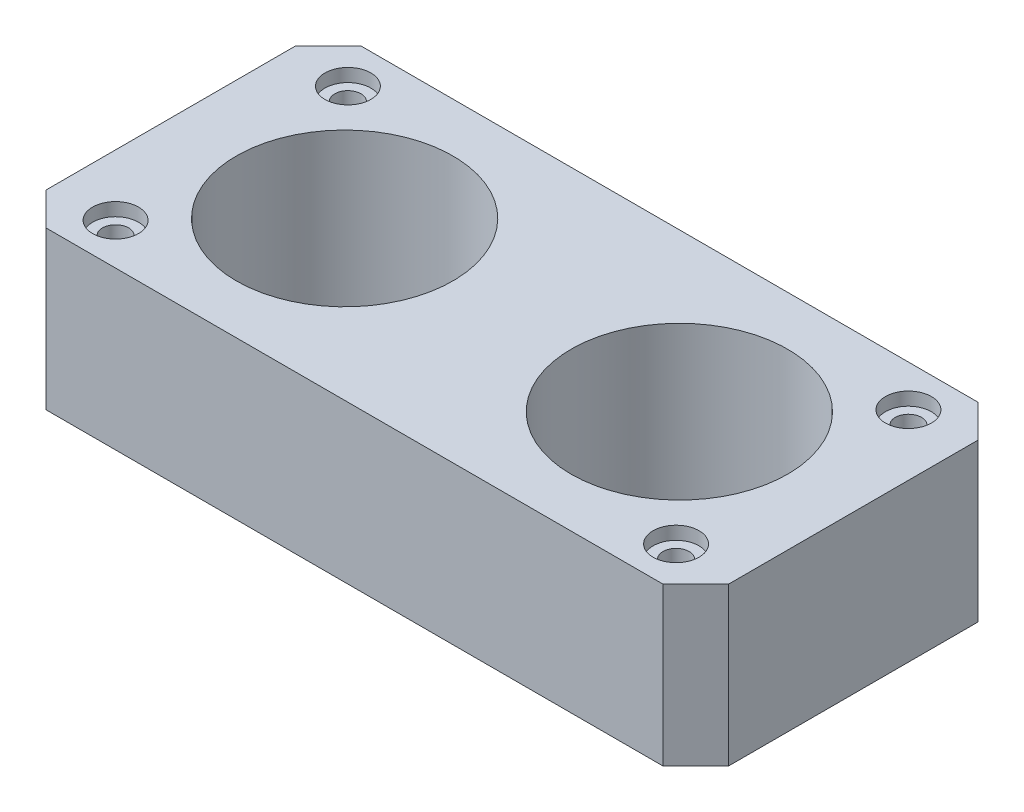
ISO-10303-21;
HEADER;
FILE_DESCRIPTION(('STEP AP214'),'2;1');
FILE_NAME('part.step','',(''),(''),'','','');
FILE_SCHEMA(('AUTOMOTIVE_DESIGN { 1 0 10303 214 1 1 1 1 }'));
ENDSEC;
DATA;
#1=APPLICATION_CONTEXT('core data for automotive mechanical design processes');
#2=APPLICATION_PROTOCOL_DEFINITION('international standard','automotive_design',2000,#1);
#3=PRODUCT_CONTEXT('',#1,'mechanical');
#4=PRODUCT('Part','Part','',(#3));
#5=PRODUCT_RELATED_PRODUCT_CATEGORY('part','',(#4));
#6=PRODUCT_DEFINITION_FORMATION('','',#4);
#7=PRODUCT_DEFINITION_CONTEXT('part definition',#1,'design');
#8=PRODUCT_DEFINITION('design','',#6,#7);
#9=PRODUCT_DEFINITION_SHAPE('','',#8);
#10=(LENGTH_UNIT() NAMED_UNIT(*) SI_UNIT(.MILLI.,.METRE.));
#11=(NAMED_UNIT(*) PLANE_ANGLE_UNIT() SI_UNIT($,.RADIAN.));
#12=(NAMED_UNIT(*) SI_UNIT($,.STERADIAN.) SOLID_ANGLE_UNIT());
#13=UNCERTAINTY_MEASURE_WITH_UNIT(LENGTH_MEASURE(1.E-05),#10,'distance_accuracy_value','');
#14=(GEOMETRIC_REPRESENTATION_CONTEXT(3) GLOBAL_UNCERTAINTY_ASSIGNED_CONTEXT((#13)) GLOBAL_UNIT_ASSIGNED_CONTEXT((#10,
#11,#12)) REPRESENTATION_CONTEXT('',''));
#15=CARTESIAN_POINT('',(0.,0.,0.));
#16=DIRECTION('',(0.,0.,1.));
#17=DIRECTION('',(1.,0.,0.));
#18=AXIS2_PLACEMENT_3D('',#15,#16,#17);
#19=CARTESIAN_POINT('',(0.,0.,0.));
#20=DIRECTION('',(0.,1.,0.));
#21=DIRECTION('',(0.,0.,1.));
#22=AXIS2_PLACEMENT_3D('',#19,#20,#21);
#23=PLANE('',#22);
#24=CARTESIAN_POINT('',(-12.75,0.,0.));
#25=DIRECTION('',(0.,1.,0.));
#26=DIRECTION('',(0.,0.,1.));
#27=AXIS2_PLACEMENT_3D('',#24,#25,#26);
#28=CIRCLE('',#27,8.25);
#29=CARTESIAN_POINT('',(-12.75,0.,8.25));
#30=VERTEX_POINT('',#29);
#31=EDGE_CURVE('E235',#30,#30,#28,.T.);
#32=ORIENTED_EDGE('',*,*,#31,.T.);
#33=EDGE_LOOP('',(#32));
#34=FACE_BOUND('',#33,.T.);
#35=CARTESIAN_POINT('',(12.75,0.,0.));
#36=DIRECTION('',(0.,1.,0.));
#37=DIRECTION('',(0.,0.,1.));
#38=AXIS2_PLACEMENT_3D('',#35,#36,#37);
#39=CIRCLE('',#38,8.25);
#40=CARTESIAN_POINT('',(12.75,0.,8.24999999999999));
#41=VERTEX_POINT('',#40);
#42=EDGE_CURVE('E239',#41,#41,#39,.T.);
#43=ORIENTED_EDGE('',*,*,#42,.T.);
#44=EDGE_LOOP('',(#43));
#45=FACE_BOUND('',#44,.T.);
#46=CARTESIAN_POINT('',(-21.35,0.,-8.85));
#47=DIRECTION('',(0.,1.,0.));
#48=DIRECTION('',(0.,0.,1.));
#49=AXIS2_PLACEMENT_3D('',#46,#47,#48);
#50=CIRCLE('',#49,0.999999999999998);
#51=CARTESIAN_POINT('',(-21.35,0.,-7.85));
#52=VERTEX_POINT('',#51);
#53=EDGE_CURVE('E225',#52,#52,#50,.T.);
#54=ORIENTED_EDGE('',*,*,#53,.T.);
#55=EDGE_LOOP('',(#54));
#56=FACE_BOUND('',#55,.T.);
#57=CARTESIAN_POINT('',(21.35,0.,-8.85));
#58=DIRECTION('',(0.,1.,0.));
#59=DIRECTION('',(0.,0.,1.));
#60=AXIS2_PLACEMENT_3D('',#57,#58,#59);
#61=CIRCLE('',#60,1.);
#62=CARTESIAN_POINT('',(21.35,0.,-7.85));
#63=VERTEX_POINT('',#62);
#64=EDGE_CURVE('E222',#63,#63,#61,.T.);
#65=ORIENTED_EDGE('',*,*,#64,.T.);
#66=EDGE_LOOP('',(#65));
#67=FACE_BOUND('',#66,.T.);
#68=CARTESIAN_POINT('',(21.35,0.,8.85));
#69=DIRECTION('',(0.,1.,0.));
#70=DIRECTION('',(0.,0.,1.));
#71=AXIS2_PLACEMENT_3D('',#68,#69,#70);
#72=CIRCLE('',#71,1.);
#73=CARTESIAN_POINT('',(21.35,0.,9.85));
#74=VERTEX_POINT('',#73);
#75=EDGE_CURVE('E226',#74,#74,#72,.T.);
#76=ORIENTED_EDGE('',*,*,#75,.T.);
#77=EDGE_LOOP('',(#76));
#78=FACE_BOUND('',#77,.T.);
#79=CARTESIAN_POINT('',(-21.35,0.,8.85));
#80=DIRECTION('',(0.,1.,0.));
#81=DIRECTION('',(0.,0.,1.));
#82=AXIS2_PLACEMENT_3D('',#79,#80,#81);
#83=CIRCLE('',#82,1.);
#84=CARTESIAN_POINT('',(-21.35,0.,9.85));
#85=VERTEX_POINT('',#84);
#86=EDGE_CURVE('E229',#85,#85,#83,.T.);
#87=ORIENTED_EDGE('',*,*,#86,.T.);
#88=EDGE_LOOP('',(#87));
#89=FACE_BOUND('',#88,.T.);
#90=DIRECTION('',(0.,0.,-1.));
#91=VECTOR('',#90,1.);
#92=CARTESIAN_POINT('',(26.,0.,-12.));
#93=LINE('',#92,#91);
#94=CARTESIAN_POINT('',(26.,0.,9.49999999999999));
#95=VERTEX_POINT('',#94);
#96=CARTESIAN_POINT('',(26.,0.,-9.49999999999999));
#97=VERTEX_POINT('',#96);
#98=EDGE_CURVE('E245',#95,#97,#93,.T.);
#99=ORIENTED_EDGE('',*,*,#98,.F.);
#100=DIRECTION('',(0.707106781186547,0.,-0.707106781186548));
#101=VECTOR('',#100,1.);
#102=CARTESIAN_POINT('',(26.,0.,9.49999999999999));
#103=LINE('',#102,#101);
#104=CARTESIAN_POINT('',(23.5,0.,12.));
#105=VERTEX_POINT('',#104);
#106=EDGE_CURVE('E325',#95,#105,#103,.F.);
#107=ORIENTED_EDGE('',*,*,#106,.T.);
#108=DIRECTION('',(1.,0.,0.));
#109=VECTOR('',#108,1.);
#110=CARTESIAN_POINT('',(-26.,0.,12.));
#111=LINE('',#110,#109);
#112=CARTESIAN_POINT('',(-23.5,0.,12.));
#113=VERTEX_POINT('',#112);
#114=EDGE_CURVE('E252',#113,#105,#111,.T.);
#115=ORIENTED_EDGE('',*,*,#114,.F.);
#116=DIRECTION('',(0.707106781186548,0.,0.707106781186548));
#117=VECTOR('',#116,1.);
#118=CARTESIAN_POINT('',(-23.5,0.,12.));
#119=LINE('',#118,#117);
#120=CARTESIAN_POINT('',(-26.,0.,9.5));
#121=VERTEX_POINT('',#120);
#122=EDGE_CURVE('E319',#113,#121,#119,.F.);
#123=ORIENTED_EDGE('',*,*,#122,.T.);
#124=DIRECTION('',(0.,0.,1.));
#125=VECTOR('',#124,1.);
#126=CARTESIAN_POINT('',(-26.,0.,-12.));
#127=LINE('',#126,#125);
#128=CARTESIAN_POINT('',(-26.,0.,-9.49999999999999));
#129=VERTEX_POINT('',#128);
#130=EDGE_CURVE('E167',#129,#121,#127,.T.);
#131=ORIENTED_EDGE('',*,*,#130,.F.);
#132=DIRECTION('',(-0.707106781186547,0.,0.707106781186549));
#133=VECTOR('',#132,1.);
#134=CARTESIAN_POINT('',(-26.,0.,-9.49999999999999));
#135=LINE('',#134,#133);
#136=CARTESIAN_POINT('',(-23.5,0.,-12.));
#137=VERTEX_POINT('',#136);
#138=EDGE_CURVE('E321',#129,#137,#135,.F.);
#139=ORIENTED_EDGE('',*,*,#138,.T.);
#140=DIRECTION('',(-1.,0.,0.));
#141=VECTOR('',#140,1.);
#142=CARTESIAN_POINT('',(-26.,0.,-12.));
#143=LINE('',#142,#141);
#144=CARTESIAN_POINT('',(-6.,0.,-12.));
#145=VERTEX_POINT('',#144);
#146=EDGE_CURVE('E168',#145,#137,#143,.T.);
#147=ORIENTED_EDGE('',*,*,#146,.F.);
#148=DIRECTION('',(0.,0.,1.));
#149=VECTOR('',#148,1.);
#150=CARTESIAN_POINT('',(-6.,0.,0.));
#151=LINE('',#150,#149);
#152=CARTESIAN_POINT('',(-6.,0.,-5.5));
#153=VERTEX_POINT('',#152);
#154=EDGE_CURVE('E187',#145,#153,#151,.T.);
#155=ORIENTED_EDGE('',*,*,#154,.T.);
#156=CARTESIAN_POINT('',(-5.5,0.,-5.5));
#157=DIRECTION('',(0.,1.,0.));
#158=DIRECTION('',(0.,0.,1.));
#159=AXIS2_PLACEMENT_3D('',#156,#157,#158);
#160=CIRCLE('',#159,0.5);
#161=CARTESIAN_POINT('',(-5.5,0.,-5.));
#162=VERTEX_POINT('',#161);
#163=EDGE_CURVE('E299',#153,#162,#160,.T.);
#164=ORIENTED_EDGE('',*,*,#163,.T.);
#165=DIRECTION('',(1.,0.,0.));
#166=VECTOR('',#165,1.);
#167=CARTESIAN_POINT('',(0.,0.,-5.));
#168=LINE('',#167,#166);
#169=CARTESIAN_POINT('',(5.5,0.,-5.));
#170=VERTEX_POINT('',#169);
#171=EDGE_CURVE('E184',#162,#170,#168,.T.);
#172=ORIENTED_EDGE('',*,*,#171,.T.);
#173=CARTESIAN_POINT('',(5.5,0.,-5.5));
#174=DIRECTION('',(0.,1.,0.));
#175=DIRECTION('',(0.,0.,1.));
#176=AXIS2_PLACEMENT_3D('',#173,#174,#175);
#177=CIRCLE('',#176,0.5);
#178=CARTESIAN_POINT('',(6.,0.,-5.5));
#179=VERTEX_POINT('',#178);
#180=EDGE_CURVE('E183',#170,#179,#177,.T.);
#181=ORIENTED_EDGE('',*,*,#180,.T.);
#182=DIRECTION('',(0.,0.,1.));
#183=VECTOR('',#182,1.);
#184=CARTESIAN_POINT('',(6.,0.,0.));
#185=LINE('',#184,#183);
#186=CARTESIAN_POINT('',(6.,0.,-12.));
#187=VERTEX_POINT('',#186);
#188=EDGE_CURVE('E173',#187,#179,#185,.T.);
#189=ORIENTED_EDGE('',*,*,#188,.F.);
#190=CARTESIAN_POINT('',(23.5,0.,-12.));
#191=VERTEX_POINT('',#190);
#192=EDGE_CURVE('E157',#191,#187,#143,.T.);
#193=ORIENTED_EDGE('',*,*,#192,.F.);
#194=DIRECTION('',(-0.707106781186546,0.,-0.707106781186549));
#195=VECTOR('',#194,1.);
#196=CARTESIAN_POINT('',(23.5,0.,-12.));
#197=LINE('',#196,#195);
#198=EDGE_CURVE('E323',#191,#97,#197,.F.);
#199=ORIENTED_EDGE('',*,*,#198,.T.);
#200=EDGE_LOOP('',(#99,#107,#115,#123,#131,#139,#147,#155,#164,#172,#181,#189,#193,#199));
#201=FACE_BOUND('',#200,.T.);
#202=ADVANCED_FACE('F41',(#34,#45,#56,#67,#78,#89,#201),#23,.F.);
#203=CARTESIAN_POINT('',(-26.,12.,-12.));
#204=DIRECTION('',(0.,0.,1.));
#205=DIRECTION('',(1.,0.,0.));
#206=AXIS2_PLACEMENT_3D('',#203,#204,#205);
#207=PLANE('',#206);
#208=DIRECTION('',(-1.,0.,0.));
#209=VECTOR('',#208,1.);
#210=CARTESIAN_POINT('',(-26.,12.,-12.));
#211=LINE('',#210,#209);
#212=CARTESIAN_POINT('',(23.5,12.,-12.));
#213=VERTEX_POINT('',#212);
#214=CARTESIAN_POINT('',(-23.5,12.,-12.));
#215=VERTEX_POINT('',#214);
#216=EDGE_CURVE('E251',#213,#215,#211,.T.);
#217=ORIENTED_EDGE('',*,*,#216,.F.);
#218=DIRECTION('',(0.,-1.,0.));
#219=VECTOR('',#218,1.);
#220=CARTESIAN_POINT('',(23.5,12.,-12.));
#221=LINE('',#220,#219);
#222=EDGE_CURVE('E164',#213,#191,#221,.T.);
#223=ORIENTED_EDGE('',*,*,#222,.T.);
#224=ORIENTED_EDGE('',*,*,#192,.T.);
#225=DIRECTION('',(0.,-1.,0.));
#226=VECTOR('',#225,1.);
#227=CARTESIAN_POINT('',(6.,5.,-12.));
#228=LINE('',#227,#226);
#229=CARTESIAN_POINT('',(6.,4.5,-12.));
#230=VERTEX_POINT('',#229);
#231=EDGE_CURVE('E161',#230,#187,#228,.T.);
#232=ORIENTED_EDGE('',*,*,#231,.F.);
#233=CARTESIAN_POINT('',(5.5,4.5,-12.));
#234=DIRECTION('',(0.,0.,1.));
#235=DIRECTION('',(1.,0.,0.));
#236=AXIS2_PLACEMENT_3D('',#233,#234,#235);
#237=CIRCLE('',#236,0.5);
#238=CARTESIAN_POINT('',(5.5,5.,-12.));
#239=VERTEX_POINT('',#238);
#240=EDGE_CURVE('E294',#230,#239,#237,.T.);
#241=ORIENTED_EDGE('',*,*,#240,.T.);
#242=DIRECTION('',(1.,0.,0.));
#243=VECTOR('',#242,1.);
#244=CARTESIAN_POINT('',(0.,5.,-12.));
#245=LINE('',#244,#243);
#246=CARTESIAN_POINT('',(-5.5,5.,-12.));
#247=VERTEX_POINT('',#246);
#248=EDGE_CURVE('E178',#247,#239,#245,.T.);
#249=ORIENTED_EDGE('',*,*,#248,.F.);
#250=CARTESIAN_POINT('',(-5.5,4.5,-12.));
#251=DIRECTION('',(0.,0.,1.));
#252=DIRECTION('',(1.,0.,0.));
#253=AXIS2_PLACEMENT_3D('',#250,#251,#252);
#254=CIRCLE('',#253,0.5);
#255=CARTESIAN_POINT('',(-6.,4.5,-12.));
#256=VERTEX_POINT('',#255);
#257=EDGE_CURVE('E296',#247,#256,#254,.T.);
#258=ORIENTED_EDGE('',*,*,#257,.T.);
#259=DIRECTION('',(0.,-1.,0.));
#260=VECTOR('',#259,1.);
#261=CARTESIAN_POINT('',(-6.,5.,-12.));
#262=LINE('',#261,#260);
#263=EDGE_CURVE('E177',#256,#145,#262,.T.);
#264=ORIENTED_EDGE('',*,*,#263,.T.);
#265=ORIENTED_EDGE('',*,*,#146,.T.);
#266=DIRECTION('',(0.,1.,0.));
#267=VECTOR('',#266,1.);
#268=CARTESIAN_POINT('',(-23.5,12.,-12.));
#269=LINE('',#268,#267);
#270=EDGE_CURVE('E339',#137,#215,#269,.T.);
#271=ORIENTED_EDGE('',*,*,#270,.T.);
#272=EDGE_LOOP('',(#217,#223,#224,#232,#241,#249,#258,#264,#265,#271));
#273=FACE_BOUND('',#272,.T.);
#274=ADVANCED_FACE('F160',(#273),#207,.F.);
#275=CARTESIAN_POINT('',(-21.35,0.,-8.85));
#276=DIRECTION('',(0.,1.,0.));
#277=DIRECTION('',(0.,0.,1.));
#278=AXIS2_PLACEMENT_3D('',#275,#276,#277);
#279=CYLINDRICAL_SURFACE('',#278,0.999999999999998);
#280=ORIENTED_EDGE('',*,*,#53,.F.);
#281=EDGE_LOOP('',(#280));
#282=FACE_BOUND('',#281,.T.);
#283=CARTESIAN_POINT('',(-21.35,11.,-8.85));
#284=DIRECTION('',(0.,1.,0.));
#285=DIRECTION('',(0.,0.,1.));
#286=AXIS2_PLACEMENT_3D('',#283,#284,#285);
#287=CIRCLE('',#286,0.999999999999998);
#288=CARTESIAN_POINT('',(-21.35,11.,-7.85));
#289=VERTEX_POINT('',#288);
#290=EDGE_CURVE('E232',#289,#289,#287,.F.);
#291=ORIENTED_EDGE('',*,*,#290,.F.);
#292=EDGE_LOOP('',(#291));
#293=FACE_BOUND('',#292,.T.);
#294=ADVANCED_FACE('F386',(#282,#293),#279,.F.);
#295=CARTESIAN_POINT('',(21.35,0.,-8.85));
#296=DIRECTION('',(0.,1.,0.));
#297=DIRECTION('',(0.,0.,1.));
#298=AXIS2_PLACEMENT_3D('',#295,#296,#297);
#299=CYLINDRICAL_SURFACE('',#298,1.);
#300=ORIENTED_EDGE('',*,*,#64,.F.);
#301=EDGE_LOOP('',(#300));
#302=FACE_BOUND('',#301,.T.);
#303=CARTESIAN_POINT('',(21.35,11.,-8.85));
#304=DIRECTION('',(0.,1.,0.));
#305=DIRECTION('',(0.,0.,1.));
#306=AXIS2_PLACEMENT_3D('',#303,#304,#305);
#307=CIRCLE('',#306,1.);
#308=CARTESIAN_POINT('',(21.35,11.,-7.85));
#309=VERTEX_POINT('',#308);
#310=EDGE_CURVE('E270',#309,#309,#307,.F.);
#311=ORIENTED_EDGE('',*,*,#310,.F.);
#312=EDGE_LOOP('',(#311));
#313=FACE_BOUND('',#312,.T.);
#314=ADVANCED_FACE('F507',(#302,#313),#299,.F.);
#315=CARTESIAN_POINT('',(21.35,0.,8.85));
#316=DIRECTION('',(0.,1.,0.));
#317=DIRECTION('',(0.,0.,1.));
#318=AXIS2_PLACEMENT_3D('',#315,#316,#317);
#319=CYLINDRICAL_SURFACE('',#318,1.);
#320=ORIENTED_EDGE('',*,*,#75,.F.);
#321=EDGE_LOOP('',(#320));
#322=FACE_BOUND('',#321,.T.);
#323=CARTESIAN_POINT('',(21.35,11.,8.85));
#324=DIRECTION('',(0.,1.,0.));
#325=DIRECTION('',(0.,0.,1.));
#326=AXIS2_PLACEMENT_3D('',#323,#324,#325);
#327=CIRCLE('',#326,1.);
#328=CARTESIAN_POINT('',(21.35,11.,9.85));
#329=VERTEX_POINT('',#328);
#330=EDGE_CURVE('E267',#329,#329,#327,.F.);
#331=ORIENTED_EDGE('',*,*,#330,.F.);
#332=EDGE_LOOP('',(#331));
#333=FACE_BOUND('',#332,.T.);
#334=ADVANCED_FACE('F510',(#322,#333),#319,.F.);
#335=CARTESIAN_POINT('',(-21.35,0.,8.85));
#336=DIRECTION('',(0.,1.,0.));
#337=DIRECTION('',(0.,0.,1.));
#338=AXIS2_PLACEMENT_3D('',#335,#336,#337);
#339=CYLINDRICAL_SURFACE('',#338,1.);
#340=ORIENTED_EDGE('',*,*,#86,.F.);
#341=EDGE_LOOP('',(#340));
#342=FACE_BOUND('',#341,.T.);
#343=CARTESIAN_POINT('',(-21.35,11.,8.85));
#344=DIRECTION('',(0.,1.,0.));
#345=DIRECTION('',(0.,0.,1.));
#346=AXIS2_PLACEMENT_3D('',#343,#344,#345);
#347=CIRCLE('',#346,1.);
#348=CARTESIAN_POINT('',(-21.35,11.,9.85));
#349=VERTEX_POINT('',#348);
#350=EDGE_CURVE('E219',#349,#349,#347,.F.);
#351=ORIENTED_EDGE('',*,*,#350,.F.);
#352=EDGE_LOOP('',(#351));
#353=FACE_BOUND('',#352,.T.);
#354=ADVANCED_FACE('F514',(#342,#353),#339,.F.);
#355=CARTESIAN_POINT('',(0.,12.,0.));
#356=DIRECTION('',(0.,1.,0.));
#357=DIRECTION('',(0.,0.,1.));
#358=AXIS2_PLACEMENT_3D('',#355,#356,#357);
#359=PLANE('',#358);
#360=CARTESIAN_POINT('',(-21.35,12.,8.85));
#361=DIRECTION('',(0.,1.,0.));
#362=DIRECTION('',(0.,0.,1.));
#363=AXIS2_PLACEMENT_3D('',#360,#361,#362);
#364=CIRCLE('',#363,1.75);
#365=CARTESIAN_POINT('',(-21.35,12.,10.6));
#366=VERTEX_POINT('',#365);
#367=EDGE_CURVE('E196',#366,#366,#364,.T.);
#368=ORIENTED_EDGE('',*,*,#367,.F.);
#369=EDGE_LOOP('',(#368));
#370=FACE_BOUND('',#369,.T.);
#371=CARTESIAN_POINT('',(21.35,12.,8.85));
#372=DIRECTION('',(0.,1.,0.));
#373=DIRECTION('',(0.,0.,1.));
#374=AXIS2_PLACEMENT_3D('',#371,#372,#373);
#375=CIRCLE('',#374,1.75);
#376=CARTESIAN_POINT('',(21.35,12.,10.6));
#377=VERTEX_POINT('',#376);
#378=EDGE_CURVE('E208',#377,#377,#375,.T.);
#379=ORIENTED_EDGE('',*,*,#378,.F.);
#380=EDGE_LOOP('',(#379));
#381=FACE_BOUND('',#380,.T.);
#382=CARTESIAN_POINT('',(21.35,12.,-8.85));
#383=DIRECTION('',(0.,1.,0.));
#384=DIRECTION('',(0.,0.,1.));
#385=AXIS2_PLACEMENT_3D('',#382,#383,#384);
#386=CIRCLE('',#385,1.75);
#387=CARTESIAN_POINT('',(21.35,12.,-7.1));
#388=VERTEX_POINT('',#387);
#389=EDGE_CURVE('E202',#388,#388,#386,.T.);
#390=ORIENTED_EDGE('',*,*,#389,.F.);
#391=EDGE_LOOP('',(#390));
#392=FACE_BOUND('',#391,.T.);
#393=CARTESIAN_POINT('',(-21.35,12.,-8.85));
#394=DIRECTION('',(0.,1.,0.));
#395=DIRECTION('',(0.,0.,1.));
#396=AXIS2_PLACEMENT_3D('',#393,#394,#395);
#397=CIRCLE('',#396,1.75);
#398=CARTESIAN_POINT('',(-21.35,12.,-7.1));
#399=VERTEX_POINT('',#398);
#400=EDGE_CURVE('E201',#399,#399,#397,.T.);
#401=ORIENTED_EDGE('',*,*,#400,.F.);
#402=EDGE_LOOP('',(#401));
#403=FACE_BOUND('',#402,.T.);
#404=CARTESIAN_POINT('',(12.75,12.,0.));
#405=DIRECTION('',(0.,1.,0.));
#406=DIRECTION('',(0.,0.,1.));
#407=AXIS2_PLACEMENT_3D('',#404,#405,#406);
#408=CIRCLE('',#407,8.25);
#409=CARTESIAN_POINT('',(12.75,12.,8.24999999999999));
#410=VERTEX_POINT('',#409);
#411=EDGE_CURVE('E242',#410,#410,#408,.T.);
#412=ORIENTED_EDGE('',*,*,#411,.F.);
#413=EDGE_LOOP('',(#412));
#414=FACE_BOUND('',#413,.T.);
#415=DIRECTION('',(1.,0.,0.));
#416=VECTOR('',#415,1.);
#417=CARTESIAN_POINT('',(-26.,12.,12.));
#418=LINE('',#417,#416);
#419=CARTESIAN_POINT('',(-23.5,12.,12.));
#420=VERTEX_POINT('',#419);
#421=CARTESIAN_POINT('',(23.5,12.,12.));
#422=VERTEX_POINT('',#421);
#423=EDGE_CURVE('E256',#420,#422,#418,.T.);
#424=ORIENTED_EDGE('',*,*,#423,.T.);
#425=DIRECTION('',(-0.707106781186547,0.,0.707106781186548));
#426=VECTOR('',#425,1.);
#427=CARTESIAN_POINT('',(17.75,12.,17.75));
#428=LINE('',#427,#426);
#429=CARTESIAN_POINT('',(26.,12.,9.49999999999999));
#430=VERTEX_POINT('',#429);
#431=EDGE_CURVE('E337',#422,#430,#428,.F.);
#432=ORIENTED_EDGE('',*,*,#431,.T.);
#433=DIRECTION('',(0.,0.,-1.));
#434=VECTOR('',#433,1.);
#435=CARTESIAN_POINT('',(26.,12.,-12.));
#436=LINE('',#435,#434);
#437=CARTESIAN_POINT('',(26.,12.,-9.49999999999999));
#438=VERTEX_POINT('',#437);
#439=EDGE_CURVE('E248',#430,#438,#436,.T.);
#440=ORIENTED_EDGE('',*,*,#439,.T.);
#441=DIRECTION('',(0.707106781186546,0.,0.707106781186549));
#442=VECTOR('',#441,1.);
#443=CARTESIAN_POINT('',(17.75,12.,-17.75));
#444=LINE('',#443,#442);
#445=EDGE_CURVE('E335',#438,#213,#444,.F.);
#446=ORIENTED_EDGE('',*,*,#445,.T.);
#447=ORIENTED_EDGE('',*,*,#216,.T.);
#448=DIRECTION('',(0.707106781186547,0.,-0.707106781186549));
#449=VECTOR('',#448,1.);
#450=CARTESIAN_POINT('',(-17.75,12.,-17.75));
#451=LINE('',#450,#449);
#452=CARTESIAN_POINT('',(-26.,12.,-9.49999999999999));
#453=VERTEX_POINT('',#452);
#454=EDGE_CURVE('E63',#215,#453,#451,.F.);
#455=ORIENTED_EDGE('',*,*,#454,.T.);
#456=DIRECTION('',(0.,0.,1.));
#457=VECTOR('',#456,1.);
#458=CARTESIAN_POINT('',(-26.,12.,-12.));
#459=LINE('',#458,#457);
#460=CARTESIAN_POINT('',(-26.,12.,9.5));
#461=VERTEX_POINT('',#460);
#462=EDGE_CURVE('E254',#453,#461,#459,.T.);
#463=ORIENTED_EDGE('',*,*,#462,.T.);
#464=DIRECTION('',(-0.707106781186548,0.,-0.707106781186548));
#465=VECTOR('',#464,1.);
#466=CARTESIAN_POINT('',(-17.75,12.,17.75));
#467=LINE('',#466,#465);
#468=EDGE_CURVE('E332',#461,#420,#467,.F.);
#469=ORIENTED_EDGE('',*,*,#468,.T.);
#470=EDGE_LOOP('',(#424,#432,#440,#446,#447,#455,#463,#469));
#471=FACE_BOUND('',#470,.T.);
#472=CARTESIAN_POINT('',(-12.75,12.,0.));
#473=DIRECTION('',(0.,1.,0.));
#474=DIRECTION('',(0.,0.,1.));
#475=AXIS2_PLACEMENT_3D('',#472,#473,#474);
#476=CIRCLE('',#475,8.25);
#477=CARTESIAN_POINT('',(-12.75,12.,8.25));
#478=VERTEX_POINT('',#477);
#479=EDGE_CURVE('E236',#478,#478,#476,.T.);
#480=ORIENTED_EDGE('',*,*,#479,.F.);
#481=EDGE_LOOP('',(#480));
#482=FACE_BOUND('',#481,.T.);
#483=ADVANCED_FACE('F345',(#370,#381,#392,#403,#414,#471,#482),#359,.T.);
#484=CARTESIAN_POINT('',(26.,12.,-12.));
#485=DIRECTION('',(-1.,0.,0.));
#486=DIRECTION('',(0.,0.,1.));
#487=AXIS2_PLACEMENT_3D('',#484,#485,#486);
#488=PLANE('',#487);
#489=ORIENTED_EDGE('',*,*,#439,.F.);
#490=DIRECTION('',(0.,-1.,0.));
#491=VECTOR('',#490,1.);
#492=CARTESIAN_POINT('',(26.,12.,9.49999999999999));
#493=LINE('',#492,#491);
#494=EDGE_CURVE('E316',#430,#95,#493,.T.);
#495=ORIENTED_EDGE('',*,*,#494,.T.);
#496=ORIENTED_EDGE('',*,*,#98,.T.);
#497=DIRECTION('',(0.,1.,0.));
#498=VECTOR('',#497,1.);
#499=CARTESIAN_POINT('',(26.,12.,-9.49999999999999));
#500=LINE('',#499,#498);
#501=EDGE_CURVE('E301',#97,#438,#500,.T.);
#502=ORIENTED_EDGE('',*,*,#501,.T.);
#503=EDGE_LOOP('',(#489,#495,#496,#502));
#504=FACE_BOUND('',#503,.T.);
#505=ADVANCED_FACE('F366',(#504),#488,.F.);
#506=CARTESIAN_POINT('',(-26.,12.,-12.));
#507=DIRECTION('',(1.,0.,0.));
#508=DIRECTION('',(0.,0.,-1.));
#509=AXIS2_PLACEMENT_3D('',#506,#507,#508);
#510=PLANE('',#509);
#511=ORIENTED_EDGE('',*,*,#462,.F.);
#512=DIRECTION('',(0.,-1.,0.));
#513=VECTOR('',#512,1.);
#514=CARTESIAN_POINT('',(-26.,12.,-9.49999999999999));
#515=LINE('',#514,#513);
#516=EDGE_CURVE('E11',#453,#129,#515,.T.);
#517=ORIENTED_EDGE('',*,*,#516,.T.);
#518=ORIENTED_EDGE('',*,*,#130,.T.);
#519=DIRECTION('',(0.,1.,0.));
#520=VECTOR('',#519,1.);
#521=CARTESIAN_POINT('',(-26.,12.,9.5));
#522=LINE('',#521,#520);
#523=EDGE_CURVE('E50',#121,#461,#522,.T.);
#524=ORIENTED_EDGE('',*,*,#523,.T.);
#525=EDGE_LOOP('',(#511,#517,#518,#524));
#526=FACE_BOUND('',#525,.T.);
#527=ADVANCED_FACE('F351',(#526),#510,.F.);
#528=CARTESIAN_POINT('',(-26.,12.,12.));
#529=DIRECTION('',(0.,0.,-1.));
#530=DIRECTION('',(-1.,0.,0.));
#531=AXIS2_PLACEMENT_3D('',#528,#529,#530);
#532=PLANE('',#531);
#533=ORIENTED_EDGE('',*,*,#114,.T.);
#534=DIRECTION('',(0.,1.,0.));
#535=VECTOR('',#534,1.);
#536=CARTESIAN_POINT('',(23.5,12.,12.));
#537=LINE('',#536,#535);
#538=EDGE_CURVE('E330',#105,#422,#537,.T.);
#539=ORIENTED_EDGE('',*,*,#538,.T.);
#540=ORIENTED_EDGE('',*,*,#423,.F.);
#541=DIRECTION('',(0.,-1.,0.));
#542=VECTOR('',#541,1.);
#543=CARTESIAN_POINT('',(-23.5,12.,12.));
#544=LINE('',#543,#542);
#545=EDGE_CURVE('E327',#420,#113,#544,.T.);
#546=ORIENTED_EDGE('',*,*,#545,.T.);
#547=EDGE_LOOP('',(#533,#539,#540,#546));
#548=FACE_BOUND('',#547,.T.);
#549=ADVANCED_FACE('F358',(#548),#532,.F.);
#550=CARTESIAN_POINT('',(12.75,12.,0.));
#551=DIRECTION('',(0.,-1.,0.));
#552=DIRECTION('',(0.,0.,-1.));
#553=AXIS2_PLACEMENT_3D('',#550,#551,#552);
#554=CYLINDRICAL_SURFACE('',#553,8.25);
#555=ORIENTED_EDGE('',*,*,#411,.T.);
#556=EDGE_LOOP('',(#555));
#557=FACE_BOUND('',#556,.T.);
#558=ORIENTED_EDGE('',*,*,#42,.F.);
#559=EDGE_LOOP('',(#558));
#560=FACE_BOUND('',#559,.T.);
#561=ADVANCED_FACE('F394',(#557,#560),#554,.F.);
#562=CARTESIAN_POINT('',(-12.75,12.,0.));
#563=DIRECTION('',(0.,-1.,0.));
#564=DIRECTION('',(0.,0.,-1.));
#565=AXIS2_PLACEMENT_3D('',#562,#563,#564);
#566=CYLINDRICAL_SURFACE('',#565,8.25);
#567=ORIENTED_EDGE('',*,*,#479,.T.);
#568=EDGE_LOOP('',(#567));
#569=FACE_BOUND('',#568,.T.);
#570=ORIENTED_EDGE('',*,*,#31,.F.);
#571=EDGE_LOOP('',(#570));
#572=FACE_BOUND('',#571,.T.);
#573=ADVANCED_FACE('F496',(#569,#572),#566,.F.);
#574=CARTESIAN_POINT('',(-21.35,11.,8.85));
#575=DIRECTION('',(0.,1.,0.));
#576=DIRECTION('',(0.,0.,1.));
#577=AXIS2_PLACEMENT_3D('',#574,#575,#576);
#578=PLANE('',#577);
#579=CARTESIAN_POINT('',(-21.35,11.,8.85));
#580=DIRECTION('',(0.,1.,0.));
#581=DIRECTION('',(0.,0.,1.));
#582=AXIS2_PLACEMENT_3D('',#579,#580,#581);
#583=CIRCLE('',#582,1.75);
#584=CARTESIAN_POINT('',(-21.35,11.,10.6));
#585=VERTEX_POINT('',#584);
#586=EDGE_CURVE('E211',#585,#585,#583,.T.);
#587=ORIENTED_EDGE('',*,*,#586,.T.);
#588=EDGE_LOOP('',(#587));
#589=FACE_BOUND('',#588,.T.);
#590=ORIENTED_EDGE('',*,*,#350,.T.);
#591=EDGE_LOOP('',(#590));
#592=FACE_BOUND('',#591,.T.);
#593=ADVANCED_FACE('F493',(#589,#592),#578,.T.);
#594=CARTESIAN_POINT('',(-21.35,11.,8.85));
#595=DIRECTION('',(0.,1.,0.));
#596=DIRECTION('',(0.,0.,1.));
#597=AXIS2_PLACEMENT_3D('',#594,#595,#596);
#598=CYLINDRICAL_SURFACE('',#597,1.75);
#599=ORIENTED_EDGE('',*,*,#586,.F.);
#600=EDGE_LOOP('',(#599));
#601=FACE_BOUND('',#600,.T.);
#602=ORIENTED_EDGE('',*,*,#367,.T.);
#603=EDGE_LOOP('',(#602));
#604=FACE_BOUND('',#603,.T.);
#605=ADVANCED_FACE('F488',(#601,#604),#598,.F.);
#606=CARTESIAN_POINT('',(21.35,11.,8.85));
#607=DIRECTION('',(0.,1.,0.));
#608=DIRECTION('',(0.,0.,1.));
#609=AXIS2_PLACEMENT_3D('',#606,#607,#608);
#610=PLANE('',#609);
#611=CARTESIAN_POINT('',(21.35,11.,8.85));
#612=DIRECTION('',(0.,1.,0.));
#613=DIRECTION('',(0.,0.,1.));
#614=AXIS2_PLACEMENT_3D('',#611,#612,#613);
#615=CIRCLE('',#614,1.75);
#616=CARTESIAN_POINT('',(21.35,11.,10.6));
#617=VERTEX_POINT('',#616);
#618=EDGE_CURVE('E205',#617,#617,#615,.T.);
#619=ORIENTED_EDGE('',*,*,#618,.T.);
#620=EDGE_LOOP('',(#619));
#621=FACE_BOUND('',#620,.T.);
#622=ORIENTED_EDGE('',*,*,#330,.T.);
#623=EDGE_LOOP('',(#622));
#624=FACE_BOUND('',#623,.T.);
#625=ADVANCED_FACE('F485',(#621,#624),#610,.T.);
#626=CARTESIAN_POINT('',(21.35,11.,8.85));
#627=DIRECTION('',(0.,1.,0.));
#628=DIRECTION('',(0.,0.,1.));
#629=AXIS2_PLACEMENT_3D('',#626,#627,#628);
#630=CYLINDRICAL_SURFACE('',#629,1.75);
#631=ORIENTED_EDGE('',*,*,#618,.F.);
#632=EDGE_LOOP('',(#631));
#633=FACE_BOUND('',#632,.T.);
#634=ORIENTED_EDGE('',*,*,#378,.T.);
#635=EDGE_LOOP('',(#634));
#636=FACE_BOUND('',#635,.T.);
#637=ADVANCED_FACE('F479',(#633,#636),#630,.F.);
#638=CARTESIAN_POINT('',(21.35,11.,-8.85));
#639=DIRECTION('',(0.,1.,0.));
#640=DIRECTION('',(0.,0.,1.));
#641=AXIS2_PLACEMENT_3D('',#638,#639,#640);
#642=PLANE('',#641);
#643=CARTESIAN_POINT('',(21.35,11.,-8.85));
#644=DIRECTION('',(0.,1.,0.));
#645=DIRECTION('',(0.,0.,1.));
#646=AXIS2_PLACEMENT_3D('',#643,#644,#645);
#647=CIRCLE('',#646,1.75);
#648=CARTESIAN_POINT('',(21.35,11.,-7.1));
#649=VERTEX_POINT('',#648);
#650=EDGE_CURVE('E198',#649,#649,#647,.T.);
#651=ORIENTED_EDGE('',*,*,#650,.T.);
#652=EDGE_LOOP('',(#651));
#653=FACE_BOUND('',#652,.T.);
#654=ORIENTED_EDGE('',*,*,#310,.T.);
#655=EDGE_LOOP('',(#654));
#656=FACE_BOUND('',#655,.T.);
#657=ADVANCED_FACE('F475',(#653,#656),#642,.T.);
#658=CARTESIAN_POINT('',(21.35,11.,-8.85));
#659=DIRECTION('',(0.,1.,0.));
#660=DIRECTION('',(0.,0.,1.));
#661=AXIS2_PLACEMENT_3D('',#658,#659,#660);
#662=CYLINDRICAL_SURFACE('',#661,1.75);
#663=ORIENTED_EDGE('',*,*,#650,.F.);
#664=EDGE_LOOP('',(#663));
#665=FACE_BOUND('',#664,.T.);
#666=ORIENTED_EDGE('',*,*,#389,.T.);
#667=EDGE_LOOP('',(#666));
#668=FACE_BOUND('',#667,.T.);
#669=ADVANCED_FACE('F478',(#665,#668),#662,.F.);
#670=CARTESIAN_POINT('',(-21.35,11.,-8.85));
#671=DIRECTION('',(0.,1.,0.));
#672=DIRECTION('',(0.,0.,1.));
#673=AXIS2_PLACEMENT_3D('',#670,#671,#672);
#674=PLANE('',#673);
#675=CARTESIAN_POINT('',(-21.35,11.,-8.85));
#676=DIRECTION('',(0.,1.,0.));
#677=DIRECTION('',(0.,0.,1.));
#678=AXIS2_PLACEMENT_3D('',#675,#676,#677);
#679=CIRCLE('',#678,1.75);
#680=CARTESIAN_POINT('',(-21.35,11.,-7.1));
#681=VERTEX_POINT('',#680);
#682=EDGE_CURVE('E216',#681,#681,#679,.T.);
#683=ORIENTED_EDGE('',*,*,#682,.T.);
#684=EDGE_LOOP('',(#683));
#685=FACE_BOUND('',#684,.T.);
#686=ORIENTED_EDGE('',*,*,#290,.T.);
#687=EDGE_LOOP('',(#686));
#688=FACE_BOUND('',#687,.T.);
#689=ADVANCED_FACE('F483',(#685,#688),#674,.T.);
#690=CARTESIAN_POINT('',(-21.35,11.,-8.85));
#691=DIRECTION('',(0.,1.,0.));
#692=DIRECTION('',(0.,0.,1.));
#693=AXIS2_PLACEMENT_3D('',#690,#691,#692);
#694=CYLINDRICAL_SURFACE('',#693,1.75);
#695=ORIENTED_EDGE('',*,*,#682,.F.);
#696=EDGE_LOOP('',(#695));
#697=FACE_BOUND('',#696,.T.);
#698=ORIENTED_EDGE('',*,*,#400,.T.);
#699=EDGE_LOOP('',(#698));
#700=FACE_BOUND('',#699,.T.);
#701=ADVANCED_FACE('F472',(#697,#700),#694,.F.);
#702=CARTESIAN_POINT('',(-6.,5.,0.));
#703=DIRECTION('',(1.,0.,0.));
#704=DIRECTION('',(0.,0.,-1.));
#705=AXIS2_PLACEMENT_3D('',#702,#703,#704);
#706=PLANE('',#705);
#707=ORIENTED_EDGE('',*,*,#263,.F.);
#708=DIRECTION('',(0.,0.,1.));
#709=VECTOR('',#708,1.);
#710=CARTESIAN_POINT('',(-6.,4.5,-5.));
#711=LINE('',#710,#709);
#712=CARTESIAN_POINT('',(-6.,4.5,-5.5));
#713=VERTEX_POINT('',#712);
#714=EDGE_CURVE('E286',#256,#713,#711,.T.);
#715=ORIENTED_EDGE('',*,*,#714,.T.);
#716=DIRECTION('',(0.,-1.,0.));
#717=VECTOR('',#716,1.);
#718=CARTESIAN_POINT('',(-6.,0.,-5.5));
#719=LINE('',#718,#717);
#720=EDGE_CURVE('E284',#713,#153,#719,.T.);
#721=ORIENTED_EDGE('',*,*,#720,.T.);
#722=ORIENTED_EDGE('',*,*,#154,.F.);
#723=EDGE_LOOP('',(#707,#715,#721,#722));
#724=FACE_BOUND('',#723,.T.);
#725=ADVANCED_FACE('F449',(#724),#706,.T.);
#726=CARTESIAN_POINT('',(0.,5.,-5.));
#727=DIRECTION('',(0.,0.,-1.));
#728=DIRECTION('',(-1.,0.,0.));
#729=AXIS2_PLACEMENT_3D('',#726,#727,#728);
#730=PLANE('',#729);
#731=DIRECTION('',(1.,0.,0.));
#732=VECTOR('',#731,1.);
#733=CARTESIAN_POINT('',(6.,4.5,-5.));
#734=LINE('',#733,#732);
#735=CARTESIAN_POINT('',(-5.5,4.5,-5.));
#736=VERTEX_POINT('',#735);
#737=CARTESIAN_POINT('',(5.5,4.5,-5.));
#738=VERTEX_POINT('',#737);
#739=EDGE_CURVE('E290',#736,#738,#734,.T.);
#740=ORIENTED_EDGE('',*,*,#739,.T.);
#741=DIRECTION('',(0.,-1.,0.));
#742=VECTOR('',#741,1.);
#743=CARTESIAN_POINT('',(5.5,5.,-5.));
#744=LINE('',#743,#742);
#745=EDGE_CURVE('E292',#738,#170,#744,.T.);
#746=ORIENTED_EDGE('',*,*,#745,.T.);
#747=ORIENTED_EDGE('',*,*,#171,.F.);
#748=DIRECTION('',(0.,-1.,0.));
#749=VECTOR('',#748,1.);
#750=CARTESIAN_POINT('',(-5.5,5.,-5.));
#751=LINE('',#750,#749);
#752=EDGE_CURVE('E288',#162,#736,#751,.F.);
#753=ORIENTED_EDGE('',*,*,#752,.T.);
#754=EDGE_LOOP('',(#740,#746,#747,#753));
#755=FACE_BOUND('',#754,.T.);
#756=ADVANCED_FACE('F457',(#755),#730,.T.);
#757=CARTESIAN_POINT('',(6.,5.,0.));
#758=DIRECTION('',(1.,0.,0.));
#759=DIRECTION('',(0.,0.,-1.));
#760=AXIS2_PLACEMENT_3D('',#757,#758,#759);
#761=PLANE('',#760);
#762=DIRECTION('',(0.,-1.,0.));
#763=VECTOR('',#762,1.);
#764=CARTESIAN_POINT('',(6.,5.,-5.5));
#765=LINE('',#764,#763);
#766=CARTESIAN_POINT('',(6.,4.5,-5.5));
#767=VERTEX_POINT('',#766);
#768=EDGE_CURVE('E281',#179,#767,#765,.F.);
#769=ORIENTED_EDGE('',*,*,#768,.T.);
#770=DIRECTION('',(0.,0.,1.));
#771=VECTOR('',#770,1.);
#772=CARTESIAN_POINT('',(6.,4.5,0.));
#773=LINE('',#772,#771);
#774=EDGE_CURVE('E176',#767,#230,#773,.F.);
#775=ORIENTED_EDGE('',*,*,#774,.T.);
#776=ORIENTED_EDGE('',*,*,#231,.T.);
#777=ORIENTED_EDGE('',*,*,#188,.T.);
#778=EDGE_LOOP('',(#769,#775,#776,#777));
#779=FACE_BOUND('',#778,.T.);
#780=ADVANCED_FACE('F172',(#779),#761,.F.);
#781=CARTESIAN_POINT('',(0.,5.,0.));
#782=DIRECTION('',(0.,-1.,0.));
#783=DIRECTION('',(0.,0.,-1.));
#784=AXIS2_PLACEMENT_3D('',#781,#782,#783);
#785=PLANE('',#784);
#786=ORIENTED_EDGE('',*,*,#248,.T.);
#787=DIRECTION('',(0.,0.,1.));
#788=VECTOR('',#787,1.);
#789=CARTESIAN_POINT('',(5.5,5.,0.));
#790=LINE('',#789,#788);
#791=CARTESIAN_POINT('',(5.5,5.,-5.5));
#792=VERTEX_POINT('',#791);
#793=EDGE_CURVE('E278',#239,#792,#790,.T.);
#794=ORIENTED_EDGE('',*,*,#793,.T.);
#795=DIRECTION('',(1.,0.,0.));
#796=VECTOR('',#795,1.);
#797=CARTESIAN_POINT('',(-6.,5.,-5.5));
#798=LINE('',#797,#796);
#799=CARTESIAN_POINT('',(-5.5,5.,-5.5));
#800=VERTEX_POINT('',#799);
#801=EDGE_CURVE('E259',#792,#800,#798,.F.);
#802=ORIENTED_EDGE('',*,*,#801,.T.);
#803=DIRECTION('',(0.,0.,1.));
#804=VECTOR('',#803,1.);
#805=CARTESIAN_POINT('',(-5.5,5.,-12.));
#806=LINE('',#805,#804);
#807=EDGE_CURVE('E276',#800,#247,#806,.F.);
#808=ORIENTED_EDGE('',*,*,#807,.T.);
#809=EDGE_LOOP('',(#786,#794,#802,#808));
#810=FACE_BOUND('',#809,.T.);
#811=ADVANCED_FACE('F423',(#810),#785,.T.);
#812=CARTESIAN_POINT('',(-5.5,4.5,0.));
#813=DIRECTION('',(0.,0.,-1.));
#814=DIRECTION('',(-1.,0.,0.));
#815=AXIS2_PLACEMENT_3D('',#812,#813,#814);
#816=CYLINDRICAL_SURFACE('',#815,0.5);
#817=ORIENTED_EDGE('',*,*,#257,.F.);
#818=ORIENTED_EDGE('',*,*,#807,.F.);
#819=CARTESIAN_POINT('',(-5.5,4.5,-5.5));
#820=DIRECTION('',(0.,0.,-1.));
#821=DIRECTION('',(-1.,0.,0.));
#822=AXIS2_PLACEMENT_3D('',#819,#820,#821);
#823=CIRCLE('',#822,0.5);
#824=EDGE_CURVE('E185',#713,#800,#823,.T.);
#825=ORIENTED_EDGE('',*,*,#824,.F.);
#826=ORIENTED_EDGE('',*,*,#714,.F.);
#827=EDGE_LOOP('',(#817,#818,#825,#826));
#828=FACE_BOUND('',#827,.T.);
#829=ADVANCED_FACE('F420',(#828),#816,.F.);
#830=CARTESIAN_POINT('',(-5.5,5.,-5.5));
#831=DIRECTION('',(0.,1.,0.));
#832=DIRECTION('',(0.,0.,1.));
#833=AXIS2_PLACEMENT_3D('',#830,#831,#832);
#834=CYLINDRICAL_SURFACE('',#833,0.5);
#835=ORIENTED_EDGE('',*,*,#163,.F.);
#836=ORIENTED_EDGE('',*,*,#720,.F.);
#837=CARTESIAN_POINT('',(-5.5,4.5,-5.5));
#838=DIRECTION('',(0.,-1.,0.));
#839=DIRECTION('',(0.,0.,-1.));
#840=AXIS2_PLACEMENT_3D('',#837,#838,#839);
#841=CIRCLE('',#840,0.5);
#842=EDGE_CURVE('E190',#736,#713,#841,.T.);
#843=ORIENTED_EDGE('',*,*,#842,.F.);
#844=ORIENTED_EDGE('',*,*,#752,.F.);
#845=EDGE_LOOP('',(#835,#836,#843,#844));
#846=FACE_BOUND('',#845,.T.);
#847=ADVANCED_FACE('F416',(#846),#834,.F.);
#848=CARTESIAN_POINT('',(-5.5,4.5,-5.5));
#849=DIRECTION('',(0.,0.,1.));
#850=DIRECTION('',(1.,0.,0.));
#851=AXIS2_PLACEMENT_3D('',#848,#849,#850);
#852=SPHERICAL_SURFACE('',#851,0.5);
#853=ORIENTED_EDGE('',*,*,#842,.T.);
#854=ORIENTED_EDGE('',*,*,#824,.T.);
#855=CARTESIAN_POINT('',(-5.5,4.5,-5.5));
#856=DIRECTION('',(1.,0.,0.));
#857=DIRECTION('',(0.,0.,-1.));
#858=AXIS2_PLACEMENT_3D('',#855,#856,#857);
#859=CIRCLE('',#858,0.5);
#860=EDGE_CURVE('E310',#736,#800,#859,.F.);
#861=ORIENTED_EDGE('',*,*,#860,.F.);
#862=EDGE_LOOP('',(#853,#854,#861));
#863=FACE_BOUND('',#862,.T.);
#864=ADVANCED_FACE('F412',(#863),#852,.F.);
#865=CARTESIAN_POINT('',(0.,4.5,-5.5));
#866=DIRECTION('',(-1.,0.,0.));
#867=DIRECTION('',(0.,0.,1.));
#868=AXIS2_PLACEMENT_3D('',#865,#866,#867);
#869=CYLINDRICAL_SURFACE('',#868,0.5);
#870=ORIENTED_EDGE('',*,*,#860,.T.);
#871=ORIENTED_EDGE('',*,*,#801,.F.);
#872=CARTESIAN_POINT('',(5.5,4.5,-5.5));
#873=DIRECTION('',(-1.,0.,0.));
#874=DIRECTION('',(0.,0.,1.));
#875=AXIS2_PLACEMENT_3D('',#872,#873,#874);
#876=CIRCLE('',#875,0.5);
#877=EDGE_CURVE('E307',#738,#792,#876,.T.);
#878=ORIENTED_EDGE('',*,*,#877,.F.);
#879=ORIENTED_EDGE('',*,*,#739,.F.);
#880=EDGE_LOOP('',(#870,#871,#878,#879));
#881=FACE_BOUND('',#880,.T.);
#882=ADVANCED_FACE('F408',(#881),#869,.F.);
#883=CARTESIAN_POINT('',(5.5,5.,-5.5));
#884=DIRECTION('',(0.,-1.,0.));
#885=DIRECTION('',(0.,0.,-1.));
#886=AXIS2_PLACEMENT_3D('',#883,#884,#885);
#887=CYLINDRICAL_SURFACE('',#886,0.5);
#888=ORIENTED_EDGE('',*,*,#180,.F.);
#889=ORIENTED_EDGE('',*,*,#745,.F.);
#890=CARTESIAN_POINT('',(5.5,4.5,-5.5));
#891=DIRECTION('',(0.,-1.,0.));
#892=DIRECTION('',(0.,0.,-1.));
#893=AXIS2_PLACEMENT_3D('',#890,#891,#892);
#894=CIRCLE('',#893,0.5);
#895=EDGE_CURVE('E304',#767,#738,#894,.T.);
#896=ORIENTED_EDGE('',*,*,#895,.F.);
#897=ORIENTED_EDGE('',*,*,#768,.F.);
#898=EDGE_LOOP('',(#888,#889,#896,#897));
#899=FACE_BOUND('',#898,.T.);
#900=ADVANCED_FACE('F404',(#899),#887,.F.);
#901=CARTESIAN_POINT('',(5.5,4.5,-5.5));
#902=DIRECTION('',(0.,0.,1.));
#903=DIRECTION('',(1.,0.,0.));
#904=AXIS2_PLACEMENT_3D('',#901,#902,#903);
#905=SPHERICAL_SURFACE('',#904,0.5);
#906=ORIENTED_EDGE('',*,*,#895,.T.);
#907=ORIENTED_EDGE('',*,*,#877,.T.);
#908=CARTESIAN_POINT('',(5.5,4.5,-5.5));
#909=DIRECTION('',(0.,0.,-1.));
#910=DIRECTION('',(-1.,0.,0.));
#911=AXIS2_PLACEMENT_3D('',#908,#909,#910);
#912=CIRCLE('',#911,0.5);
#913=EDGE_CURVE('E302',#767,#792,#912,.F.);
#914=ORIENTED_EDGE('',*,*,#913,.F.);
#915=EDGE_LOOP('',(#906,#907,#914));
#916=FACE_BOUND('',#915,.T.);
#917=ADVANCED_FACE('F400',(#916),#905,.F.);
#918=CARTESIAN_POINT('',(5.5,4.5,0.));
#919=DIRECTION('',(0.,0.,1.));
#920=DIRECTION('',(1.,0.,0.));
#921=AXIS2_PLACEMENT_3D('',#918,#919,#920);
#922=CYLINDRICAL_SURFACE('',#921,0.5);
#923=ORIENTED_EDGE('',*,*,#240,.F.);
#924=ORIENTED_EDGE('',*,*,#774,.F.);
#925=ORIENTED_EDGE('',*,*,#913,.T.);
#926=ORIENTED_EDGE('',*,*,#793,.F.);
#927=EDGE_LOOP('',(#923,#924,#925,#926));
#928=FACE_BOUND('',#927,.T.);
#929=ADVANCED_FACE('F376',(#928),#922,.F.);
#930=CARTESIAN_POINT('',(26.,12.,9.49999999999999));
#931=DIRECTION('',(-0.707106781186548,0.,-0.707106781186547));
#932=DIRECTION('',(0.,-1.,0.));
#933=AXIS2_PLACEMENT_3D('',#930,#931,#932);
#934=PLANE('',#933);
#935=ORIENTED_EDGE('',*,*,#431,.F.);
#936=ORIENTED_EDGE('',*,*,#538,.F.);
#937=ORIENTED_EDGE('',*,*,#106,.F.);
#938=ORIENTED_EDGE('',*,*,#494,.F.);
#939=EDGE_LOOP('',(#935,#936,#937,#938));
#940=FACE_BOUND('',#939,.T.);
#941=ADVANCED_FACE('F364',(#940),#934,.F.);
#942=CARTESIAN_POINT('',(23.5,12.,-12.));
#943=DIRECTION('',(-0.707106781186549,0.,0.707106781186546));
#944=DIRECTION('',(0.,-1.,0.));
#945=AXIS2_PLACEMENT_3D('',#942,#943,#944);
#946=PLANE('',#945);
#947=ORIENTED_EDGE('',*,*,#445,.F.);
#948=ORIENTED_EDGE('',*,*,#501,.F.);
#949=ORIENTED_EDGE('',*,*,#198,.F.);
#950=ORIENTED_EDGE('',*,*,#222,.F.);
#951=EDGE_LOOP('',(#947,#948,#949,#950));
#952=FACE_BOUND('',#951,.T.);
#953=ADVANCED_FACE('F369',(#952),#946,.F.);
#954=CARTESIAN_POINT('',(-26.,12.,-9.49999999999999));
#955=DIRECTION('',(0.707106781186549,0.,0.707106781186547));
#956=DIRECTION('',(0.,-1.,0.));
#957=AXIS2_PLACEMENT_3D('',#954,#955,#956);
#958=PLANE('',#957);
#959=ORIENTED_EDGE('',*,*,#454,.F.);
#960=ORIENTED_EDGE('',*,*,#270,.F.);
#961=ORIENTED_EDGE('',*,*,#138,.F.);
#962=ORIENTED_EDGE('',*,*,#516,.F.);
#963=EDGE_LOOP('',(#959,#960,#961,#962));
#964=FACE_BOUND('',#963,.T.);
#965=ADVANCED_FACE('F349',(#964),#958,.F.);
#966=CARTESIAN_POINT('',(-23.5,12.,12.));
#967=DIRECTION('',(0.707106781186547,0.,-0.707106781186547));
#968=DIRECTION('',(0.,-1.,0.));
#969=AXIS2_PLACEMENT_3D('',#966,#967,#968);
#970=PLANE('',#969);
#971=ORIENTED_EDGE('',*,*,#468,.F.);
#972=ORIENTED_EDGE('',*,*,#523,.F.);
#973=ORIENTED_EDGE('',*,*,#122,.F.);
#974=ORIENTED_EDGE('',*,*,#545,.F.);
#975=EDGE_LOOP('',(#971,#972,#973,#974));
#976=FACE_BOUND('',#975,.T.);
#977=ADVANCED_FACE('F44',(#976),#970,.F.);
#978=CLOSED_SHELL('',(#202,#274,#294,#314,#334,#354,#483,#505,#527,#549,#561,#573,#593,#605,
#625,#637,#657,#669,#689,#701,#725,#756,#780,#811,#829,#847,#864,#882,#900,#917,#929,#941,#953,
#965,#977));
#979=MANIFOLD_SOLID_BREP('B2',#978);
#980=ADVANCED_BREP_SHAPE_REPRESENTATION('',(#18,#979),#14);
#981=SHAPE_DEFINITION_REPRESENTATION(#9,#980);
ENDSEC;
END-ISO-10303-21;
